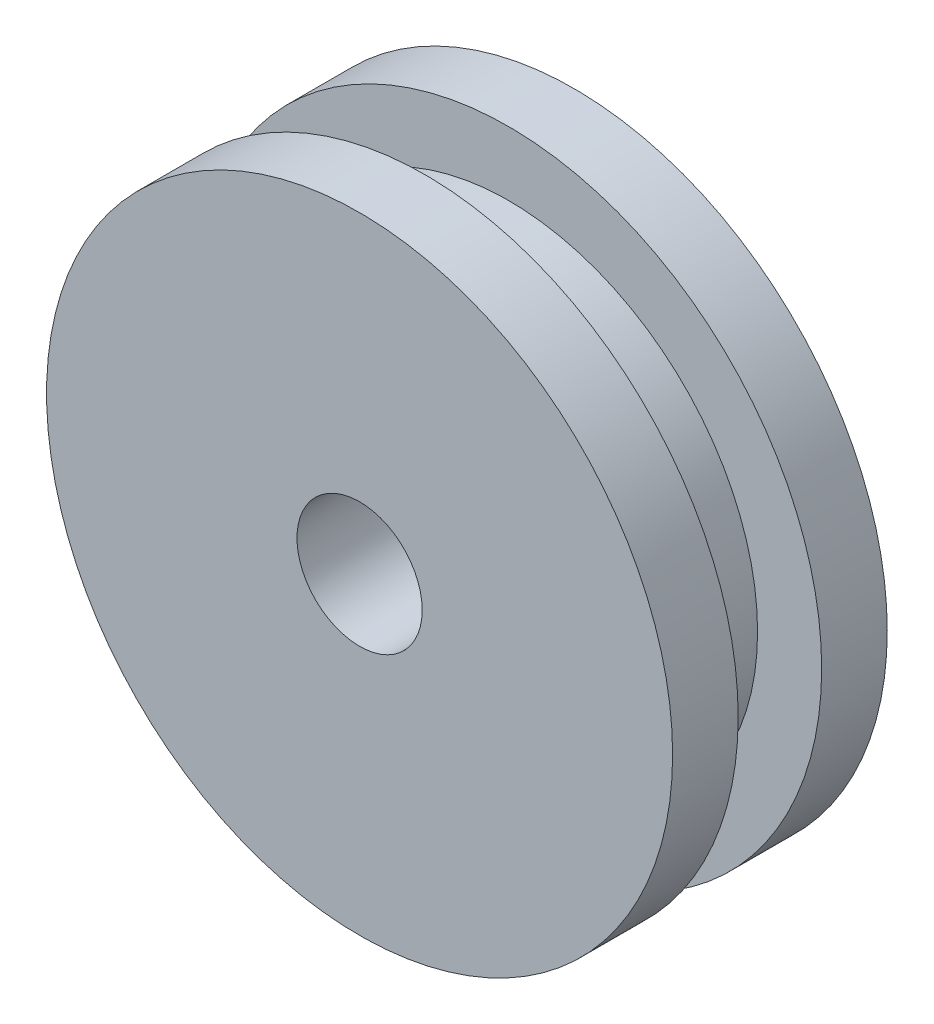
ISO-10303-21;
HEADER;
FILE_DESCRIPTION(('STEP AP214'),'2;1');
FILE_NAME('part.step','',(''),(''),'','','');
FILE_SCHEMA(('AUTOMOTIVE_DESIGN { 1 0 10303 214 1 1 1 1 }'));
ENDSEC;
DATA;
#1=APPLICATION_CONTEXT('core data for automotive mechanical design processes');
#2=APPLICATION_PROTOCOL_DEFINITION('international standard','automotive_design',2000,#1);
#3=PRODUCT_CONTEXT('',#1,'mechanical');
#4=PRODUCT('Part','Part','',(#3));
#5=PRODUCT_RELATED_PRODUCT_CATEGORY('part','',(#4));
#6=PRODUCT_DEFINITION_FORMATION('','',#4);
#7=PRODUCT_DEFINITION_CONTEXT('part definition',#1,'design');
#8=PRODUCT_DEFINITION('design','',#6,#7);
#9=PRODUCT_DEFINITION_SHAPE('','',#8);
#10=(LENGTH_UNIT() NAMED_UNIT(*) SI_UNIT(.MILLI.,.METRE.));
#11=(NAMED_UNIT(*) PLANE_ANGLE_UNIT() SI_UNIT($,.RADIAN.));
#12=(NAMED_UNIT(*) SI_UNIT($,.STERADIAN.) SOLID_ANGLE_UNIT());
#13=UNCERTAINTY_MEASURE_WITH_UNIT(LENGTH_MEASURE(1.E-05),#10,'distance_accuracy_value','');
#14=(GEOMETRIC_REPRESENTATION_CONTEXT(3) GLOBAL_UNCERTAINTY_ASSIGNED_CONTEXT((#13)) GLOBAL_UNIT_ASSIGNED_CONTEXT((#10,
#11,#12)) REPRESENTATION_CONTEXT('',''));
#15=CARTESIAN_POINT('',(0.,0.,0.));
#16=DIRECTION('',(0.,0.,1.));
#17=DIRECTION('',(1.,0.,0.));
#18=AXIS2_PLACEMENT_3D('',#15,#16,#17);
#19=CARTESIAN_POINT('',(0.,0.,1.4));
#20=DIRECTION('',(0.,0.,-1.));
#21=DIRECTION('',(-1.,0.,0.));
#22=AXIS2_PLACEMENT_3D('',#19,#20,#21);
#23=CYLINDRICAL_SURFACE('',#22,8.35);
#24=CARTESIAN_POINT('',(0.,0.,1.4));
#25=DIRECTION('',(0.,0.,1.));
#26=DIRECTION('',(1.,0.,0.));
#27=AXIS2_PLACEMENT_3D('',#24,#25,#26);
#28=CIRCLE('',#27,8.35);
#29=CARTESIAN_POINT('',(8.35,0.,1.4));
#30=VERTEX_POINT('',#29);
#31=EDGE_CURVE('E10',#30,#30,#28,.T.);
#32=ORIENTED_EDGE('',*,*,#31,.F.);
#33=EDGE_LOOP('',(#32));
#34=FACE_BOUND('',#33,.T.);
#35=CARTESIAN_POINT('',(0.,0.,-1.4));
#36=DIRECTION('',(0.,0.,1.));
#37=DIRECTION('',(1.,0.,0.));
#38=AXIS2_PLACEMENT_3D('',#35,#36,#37);
#39=CIRCLE('',#38,8.35);
#40=CARTESIAN_POINT('',(8.35,0.,-1.4));
#41=VERTEX_POINT('',#40);
#42=EDGE_CURVE('E37',#41,#41,#39,.T.);
#43=ORIENTED_EDGE('',*,*,#42,.T.);
#44=EDGE_LOOP('',(#43));
#45=FACE_BOUND('',#44,.T.);
#46=ADVANCED_FACE('F40',(#34,#45),#23,.T.);
#47=CARTESIAN_POINT('',(0.,0.,1.4));
#48=DIRECTION('',(0.,0.,-1.));
#49=DIRECTION('',(-1.,0.,0.));
#50=AXIS2_PLACEMENT_3D('',#47,#48,#49);
#51=CYLINDRICAL_SURFACE('',#50,2.1);
#52=CARTESIAN_POINT('',(0.,0.,-3.6));
#53=DIRECTION('',(0.,0.,1.));
#54=DIRECTION('',(1.,0.,0.));
#55=AXIS2_PLACEMENT_3D('',#52,#53,#54);
#56=CIRCLE('',#55,2.1);
#57=CARTESIAN_POINT('',(2.1,0.,-3.6));
#58=VERTEX_POINT('',#57);
#59=EDGE_CURVE('E55',#58,#58,#56,.T.);
#60=ORIENTED_EDGE('',*,*,#59,.F.);
#61=EDGE_LOOP('',(#60));
#62=FACE_BOUND('',#61,.T.);
#63=CARTESIAN_POINT('',(0.,0.,3.6));
#64=DIRECTION('',(0.,0.,1.));
#65=DIRECTION('',(1.,0.,0.));
#66=AXIS2_PLACEMENT_3D('',#63,#64,#65);
#67=CIRCLE('',#66,2.1);
#68=CARTESIAN_POINT('',(2.1,0.,3.6));
#69=VERTEX_POINT('',#68);
#70=EDGE_CURVE('E63',#69,#69,#67,.T.);
#71=ORIENTED_EDGE('',*,*,#70,.T.);
#72=EDGE_LOOP('',(#71));
#73=FACE_BOUND('',#72,.T.);
#74=ADVANCED_FACE('F70',(#62,#73),#51,.F.);
#75=CARTESIAN_POINT('',(0.,0.,-1.4));
#76=DIRECTION('',(0.,0.,1.));
#77=DIRECTION('',(1.,0.,0.));
#78=AXIS2_PLACEMENT_3D('',#75,#76,#77);
#79=PLANE('',#78);
#80=ORIENTED_EDGE('',*,*,#42,.F.);
#81=EDGE_LOOP('',(#80));
#82=FACE_BOUND('',#81,.T.);
#83=CARTESIAN_POINT('',(0.,0.,-1.4));
#84=DIRECTION('',(0.,0.,1.));
#85=DIRECTION('',(1.,0.,0.));
#86=AXIS2_PLACEMENT_3D('',#83,#84,#85);
#87=CIRCLE('',#86,10.5);
#88=CARTESIAN_POINT('',(10.5,0.,-1.4));
#89=VERTEX_POINT('',#88);
#90=EDGE_CURVE('E50',#89,#89,#87,.T.);
#91=ORIENTED_EDGE('',*,*,#90,.T.);
#92=EDGE_LOOP('',(#91));
#93=FACE_BOUND('',#92,.T.);
#94=ADVANCED_FACE('F89',(#82,#93),#79,.T.);
#95=CARTESIAN_POINT('',(0.,0.,-3.6));
#96=DIRECTION('',(0.,0.,1.));
#97=DIRECTION('',(1.,0.,0.));
#98=AXIS2_PLACEMENT_3D('',#95,#96,#97);
#99=PLANE('',#98);
#100=CARTESIAN_POINT('',(0.,0.,-3.6));
#101=DIRECTION('',(0.,0.,1.));
#102=DIRECTION('',(1.,0.,0.));
#103=AXIS2_PLACEMENT_3D('',#100,#101,#102);
#104=CIRCLE('',#103,10.5);
#105=CARTESIAN_POINT('',(10.5,0.,-3.6));
#106=VERTEX_POINT('',#105);
#107=EDGE_CURVE('E47',#106,#106,#104,.T.);
#108=ORIENTED_EDGE('',*,*,#107,.F.);
#109=EDGE_LOOP('',(#108));
#110=FACE_BOUND('',#109,.T.);
#111=ORIENTED_EDGE('',*,*,#59,.T.);
#112=EDGE_LOOP('',(#111));
#113=FACE_BOUND('',#112,.T.);
#114=ADVANCED_FACE('F85',(#110,#113),#99,.F.);
#115=CARTESIAN_POINT('',(0.,0.,-1.4));
#116=DIRECTION('',(0.,0.,-1.));
#117=DIRECTION('',(-1.,0.,0.));
#118=AXIS2_PLACEMENT_3D('',#115,#116,#117);
#119=CYLINDRICAL_SURFACE('',#118,10.5);
#120=ORIENTED_EDGE('',*,*,#90,.F.);
#121=EDGE_LOOP('',(#120));
#122=FACE_BOUND('',#121,.T.);
#123=ORIENTED_EDGE('',*,*,#107,.T.);
#124=EDGE_LOOP('',(#123));
#125=FACE_BOUND('',#124,.T.);
#126=ADVANCED_FACE('F75',(#122,#125),#119,.T.);
#127=CARTESIAN_POINT('',(0.,0.,3.6));
#128=DIRECTION('',(0.,0.,1.));
#129=DIRECTION('',(1.,0.,0.));
#130=AXIS2_PLACEMENT_3D('',#127,#128,#129);
#131=PLANE('',#130);
#132=CARTESIAN_POINT('',(0.,0.,3.6));
#133=DIRECTION('',(0.,0.,1.));
#134=DIRECTION('',(1.,0.,0.));
#135=AXIS2_PLACEMENT_3D('',#132,#133,#134);
#136=CIRCLE('',#135,10.5);
#137=CARTESIAN_POINT('',(10.5,0.,3.6));
#138=VERTEX_POINT('',#137);
#139=EDGE_CURVE('E60',#138,#138,#136,.T.);
#140=ORIENTED_EDGE('',*,*,#139,.T.);
#141=EDGE_LOOP('',(#140));
#142=FACE_BOUND('',#141,.T.);
#143=ORIENTED_EDGE('',*,*,#70,.F.);
#144=EDGE_LOOP('',(#143));
#145=FACE_BOUND('',#144,.T.);
#146=ADVANCED_FACE('F68',(#142,#145),#131,.T.);
#147=CARTESIAN_POINT('',(0.,0.,1.4));
#148=DIRECTION('',(0.,0.,1.));
#149=DIRECTION('',(1.,0.,0.));
#150=AXIS2_PLACEMENT_3D('',#147,#148,#149);
#151=PLANE('',#150);
#152=ORIENTED_EDGE('',*,*,#31,.T.);
#153=EDGE_LOOP('',(#152));
#154=FACE_BOUND('',#153,.T.);
#155=CARTESIAN_POINT('',(0.,0.,1.4));
#156=DIRECTION('',(0.,0.,1.));
#157=DIRECTION('',(1.,0.,0.));
#158=AXIS2_PLACEMENT_3D('',#155,#156,#157);
#159=CIRCLE('',#158,10.5);
#160=CARTESIAN_POINT('',(10.5,0.,1.4));
#161=VERTEX_POINT('',#160);
#162=EDGE_CURVE('E59',#161,#161,#159,.T.);
#163=ORIENTED_EDGE('',*,*,#162,.F.);
#164=EDGE_LOOP('',(#163));
#165=FACE_BOUND('',#164,.T.);
#166=ADVANCED_FACE('F72',(#154,#165),#151,.F.);
#167=CARTESIAN_POINT('',(0.,0.,3.6));
#168=DIRECTION('',(0.,0.,-1.));
#169=DIRECTION('',(-1.,0.,0.));
#170=AXIS2_PLACEMENT_3D('',#167,#168,#169);
#171=CYLINDRICAL_SURFACE('',#170,10.5);
#172=ORIENTED_EDGE('',*,*,#139,.F.);
#173=EDGE_LOOP('',(#172));
#174=FACE_BOUND('',#173,.T.);
#175=ORIENTED_EDGE('',*,*,#162,.T.);
#176=EDGE_LOOP('',(#175));
#177=FACE_BOUND('',#176,.T.);
#178=ADVANCED_FACE('F80',(#174,#177),#171,.T.);
#179=CLOSED_SHELL('',(#46,#74,#94,#114,#126,#146,#166,#178));
#180=MANIFOLD_SOLID_BREP('B2',#179);
#181=ADVANCED_BREP_SHAPE_REPRESENTATION('',(#18,#180),#14);
#182=SHAPE_DEFINITION_REPRESENTATION(#9,#181);
ENDSEC;
END-ISO-10303-21;
